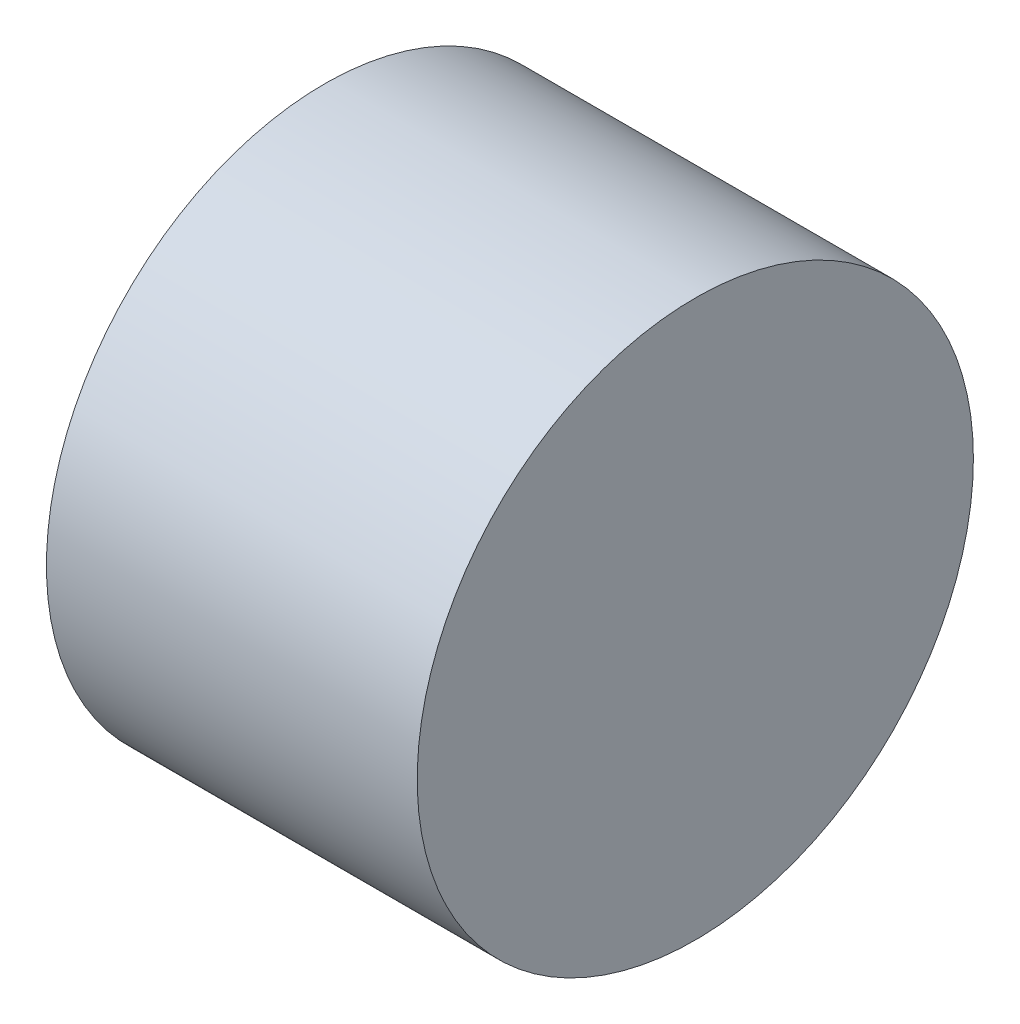
ISO-10303-21;
HEADER;
FILE_DESCRIPTION(('STEP AP214'),'2;1');
FILE_NAME('part.step','',(''),(''),'','','');
FILE_SCHEMA(('AUTOMOTIVE_DESIGN { 1 0 10303 214 1 1 1 1 }'));
ENDSEC;
DATA;
#1=APPLICATION_CONTEXT('core data for automotive mechanical design processes');
#2=APPLICATION_PROTOCOL_DEFINITION('international standard','automotive_design',2000,#1);
#3=PRODUCT_CONTEXT('',#1,'mechanical');
#4=PRODUCT('Part','Part','',(#3));
#5=PRODUCT_RELATED_PRODUCT_CATEGORY('part','',(#4));
#6=PRODUCT_DEFINITION_FORMATION('','',#4);
#7=PRODUCT_DEFINITION_CONTEXT('part definition',#1,'design');
#8=PRODUCT_DEFINITION('design','',#6,#7);
#9=PRODUCT_DEFINITION_SHAPE('','',#8);
#10=(LENGTH_UNIT() NAMED_UNIT(*) SI_UNIT(.MILLI.,.METRE.));
#11=(NAMED_UNIT(*) PLANE_ANGLE_UNIT() SI_UNIT($,.RADIAN.));
#12=(NAMED_UNIT(*) SI_UNIT($,.STERADIAN.) SOLID_ANGLE_UNIT());
#13=UNCERTAINTY_MEASURE_WITH_UNIT(LENGTH_MEASURE(1.E-05),#10,'distance_accuracy_value','');
#14=(GEOMETRIC_REPRESENTATION_CONTEXT(3) GLOBAL_UNCERTAINTY_ASSIGNED_CONTEXT((#13)) GLOBAL_UNIT_ASSIGNED_CONTEXT((#10,
#11,#12)) REPRESENTATION_CONTEXT('',''));
#15=CARTESIAN_POINT('',(0.,0.,0.));
#16=DIRECTION('',(0.,0.,1.));
#17=DIRECTION('',(1.,0.,0.));
#18=AXIS2_PLACEMENT_3D('',#15,#16,#17);
#19=CARTESIAN_POINT('',(-50.,0.,0.));
#20=DIRECTION('',(1.,0.,0.));
#21=DIRECTION('',(0.,0.,-1.));
#22=AXIS2_PLACEMENT_3D('',#19,#20,#21);
#23=CYLINDRICAL_SURFACE('',#22,75.);
#24=CARTESIAN_POINT('',(-50.,0.,0.));
#25=DIRECTION('',(1.,0.,0.));
#26=DIRECTION('',(0.,0.,-1.));
#27=AXIS2_PLACEMENT_3D('',#24,#25,#26);
#28=CIRCLE('',#27,75.);
#29=CARTESIAN_POINT('',(-50.,0.,-75.));
#30=VERTEX_POINT('',#29);
#31=EDGE_CURVE('E10',#30,#30,#28,.T.);
#32=ORIENTED_EDGE('',*,*,#31,.T.);
#33=EDGE_LOOP('',(#32));
#34=FACE_BOUND('',#33,.T.);
#35=CARTESIAN_POINT('',(50.,0.,0.));
#36=DIRECTION('',(1.,0.,0.));
#37=DIRECTION('',(0.,0.,-1.));
#38=AXIS2_PLACEMENT_3D('',#35,#36,#37);
#39=CIRCLE('',#38,75.);
#40=CARTESIAN_POINT('',(50.,0.,-75.));
#41=VERTEX_POINT('',#40);
#42=EDGE_CURVE('E44',#41,#41,#39,.T.);
#43=ORIENTED_EDGE('',*,*,#42,.F.);
#44=EDGE_LOOP('',(#43));
#45=FACE_BOUND('',#44,.T.);
#46=ADVANCED_FACE('F37',(#34,#45),#23,.T.);
#47=CARTESIAN_POINT('',(-50.,0.,0.));
#48=DIRECTION('',(1.,0.,0.));
#49=DIRECTION('',(0.,0.,-1.));
#50=AXIS2_PLACEMENT_3D('',#47,#48,#49);
#51=PLANE('',#50);
#52=ORIENTED_EDGE('',*,*,#31,.F.);
#53=EDGE_LOOP('',(#52));
#54=FACE_BOUND('',#53,.T.);
#55=ADVANCED_FACE('F54',(#54),#51,.F.);
#56=CARTESIAN_POINT('',(50.,0.,0.));
#57=DIRECTION('',(1.,0.,0.));
#58=DIRECTION('',(0.,0.,-1.));
#59=AXIS2_PLACEMENT_3D('',#56,#57,#58);
#60=PLANE('',#59);
#61=ORIENTED_EDGE('',*,*,#42,.T.);
#62=EDGE_LOOP('',(#61));
#63=FACE_BOUND('',#62,.T.);
#64=ADVANCED_FACE('F51',(#63),#60,.T.);
#65=CLOSED_SHELL('',(#46,#55,#64));
#66=MANIFOLD_SOLID_BREP('B2',#65);
#67=ADVANCED_BREP_SHAPE_REPRESENTATION('',(#18,#66),#14);
#68=SHAPE_DEFINITION_REPRESENTATION(#9,#67);
ENDSEC;
END-ISO-10303-21;
